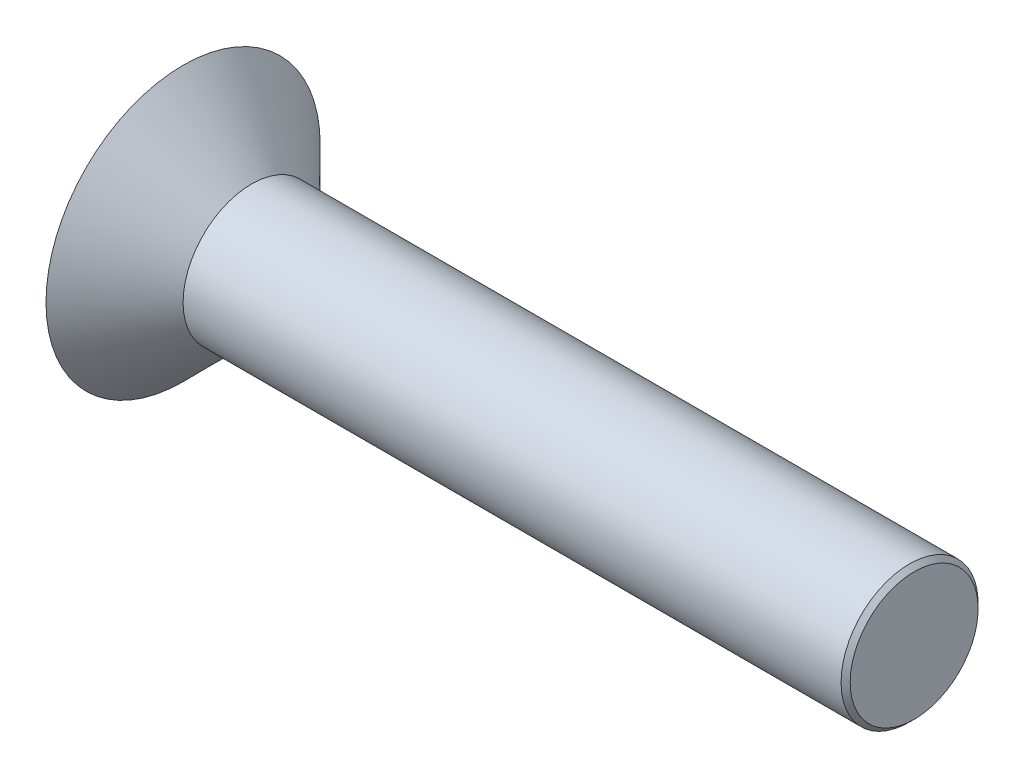
ISO-10303-21;
HEADER;
FILE_DESCRIPTION(('STEP AP214'),'2;1');
FILE_NAME('part.step','',(''),(''),'','','');
FILE_SCHEMA(('AUTOMOTIVE_DESIGN { 1 0 10303 214 1 1 1 1 }'));
ENDSEC;
DATA;
#1=APPLICATION_CONTEXT('core data for automotive mechanical design processes');
#2=APPLICATION_PROTOCOL_DEFINITION('international standard','automotive_design',2000,#1);
#3=PRODUCT_CONTEXT('',#1,'mechanical');
#4=PRODUCT('Part','Part','',(#3));
#5=PRODUCT_RELATED_PRODUCT_CATEGORY('part','',(#4));
#6=PRODUCT_DEFINITION_FORMATION('','',#4);
#7=PRODUCT_DEFINITION_CONTEXT('part definition',#1,'design');
#8=PRODUCT_DEFINITION('design','',#6,#7);
#9=PRODUCT_DEFINITION_SHAPE('','',#8);
#10=(LENGTH_UNIT() NAMED_UNIT(*) SI_UNIT(.MILLI.,.METRE.));
#11=(NAMED_UNIT(*) PLANE_ANGLE_UNIT() SI_UNIT($,.RADIAN.));
#12=(NAMED_UNIT(*) SI_UNIT($,.STERADIAN.) SOLID_ANGLE_UNIT());
#13=UNCERTAINTY_MEASURE_WITH_UNIT(LENGTH_MEASURE(1.E-05),#10,'distance_accuracy_value','');
#14=(GEOMETRIC_REPRESENTATION_CONTEXT(3) GLOBAL_UNCERTAINTY_ASSIGNED_CONTEXT((#13)) GLOBAL_UNIT_ASSIGNED_CONTEXT((#10,
#11,#12)) REPRESENTATION_CONTEXT('',''));
#15=CARTESIAN_POINT('',(0.,0.,0.));
#16=DIRECTION('',(0.,0.,1.));
#17=DIRECTION('',(1.,0.,0.));
#18=AXIS2_PLACEMENT_3D('',#15,#16,#17);
#19=CARTESIAN_POINT('',(0.,0.,0.));
#20=DIRECTION('',(1.,0.,0.));
#21=DIRECTION('',(0.,0.,-1.));
#22=AXIS2_PLACEMENT_3D('',#19,#20,#21);
#23=PLANE('',#22);
#24=DIRECTION('',(0.,0.866025403784439,-0.5));
#25=VECTOR('',#24,1.);
#26=CARTESIAN_POINT('',(0.,0.,1.44337567297406));
#27=LINE('',#26,#25);
#28=CARTESIAN_POINT('',(0.,0.,1.44337567297407));
#29=VERTEX_POINT('',#28);
#30=CARTESIAN_POINT('',(0.,1.25,0.721687836487031));
#31=VERTEX_POINT('',#30);
#32=EDGE_CURVE('E128',#29,#31,#27,.T.);
#33=ORIENTED_EDGE('',*,*,#32,.F.);
#34=DIRECTION('',(0.,0.866025403784438,0.5));
#35=VECTOR('',#34,1.);
#36=CARTESIAN_POINT('',(0.,-1.25,0.721687836487032));
#37=LINE('',#36,#35);
#38=CARTESIAN_POINT('',(0.,-1.25,0.721687836487032));
#39=VERTEX_POINT('',#38);
#40=EDGE_CURVE('E54',#39,#29,#37,.T.);
#41=ORIENTED_EDGE('',*,*,#40,.F.);
#42=DIRECTION('',(0.,0.,1.));
#43=VECTOR('',#42,1.);
#44=CARTESIAN_POINT('',(0.,-1.25,-0.721687836487033));
#45=LINE('',#44,#43);
#46=CARTESIAN_POINT('',(0.,-1.25,-0.721687836487033));
#47=VERTEX_POINT('',#46);
#48=EDGE_CURVE('E137',#47,#39,#45,.T.);
#49=ORIENTED_EDGE('',*,*,#48,.F.);
#50=DIRECTION('',(0.,-0.866025403784438,0.5));
#51=VECTOR('',#50,1.);
#52=CARTESIAN_POINT('',(0.,0.,-1.44337567297407));
#53=LINE('',#52,#51);
#54=CARTESIAN_POINT('',(0.,0.,-1.44337567297407));
#55=VERTEX_POINT('',#54);
#56=EDGE_CURVE('E135',#55,#47,#53,.T.);
#57=ORIENTED_EDGE('',*,*,#56,.F.);
#58=DIRECTION('',(0.,-0.866025403784439,-0.5));
#59=VECTOR('',#58,1.);
#60=CARTESIAN_POINT('',(0.,1.25,-0.721687836487033));
#61=LINE('',#60,#59);
#62=CARTESIAN_POINT('',(0.,1.25,-0.721687836487033));
#63=VERTEX_POINT('',#62);
#64=EDGE_CURVE('E102',#63,#55,#61,.T.);
#65=ORIENTED_EDGE('',*,*,#64,.F.);
#66=DIRECTION('',(0.,0.,-1.));
#67=VECTOR('',#66,1.);
#68=CARTESIAN_POINT('',(0.,1.25,0.721687836487031));
#69=LINE('',#68,#67);
#70=EDGE_CURVE('E131',#31,#63,#69,.T.);
#71=ORIENTED_EDGE('',*,*,#70,.F.);
#72=EDGE_LOOP('',(#33,#41,#49,#57,#65,#71));
#73=FACE_BOUND('',#72,.T.);
#74=CARTESIAN_POINT('',(0.,0.,0.));
#75=DIRECTION('',(-1.,0.,0.));
#76=DIRECTION('',(0.,0.,1.));
#77=AXIS2_PLACEMENT_3D('',#74,#75,#76);
#78=CIRCLE('',#77,3.);
#79=CARTESIAN_POINT('',(0.,0.,3.));
#80=VERTEX_POINT('',#79);
#81=EDGE_CURVE('E149',#80,#80,#78,.T.);
#82=ORIENTED_EDGE('',*,*,#81,.T.);
#83=EDGE_LOOP('',(#82));
#84=FACE_BOUND('',#83,.T.);
#85=ADVANCED_FACE('F39',(#73,#84),#23,.F.);
#86=CARTESIAN_POINT('',(1.49999999999999,0.,0.));
#87=DIRECTION('',(-1.,0.,0.));
#88=DIRECTION('',(0.,0.,1.));
#89=AXIS2_PLACEMENT_3D('',#86,#87,#88);
#90=CONICAL_SURFACE('',#89,1.5,0.78539816339745);
#91=ORIENTED_EDGE('',*,*,#81,.F.);
#92=EDGE_LOOP('',(#91));
#93=FACE_BOUND('',#92,.T.);
#94=CARTESIAN_POINT('',(1.49999999999999,0.,0.));
#95=DIRECTION('',(-1.,0.,0.));
#96=DIRECTION('',(0.,0.,1.));
#97=AXIS2_PLACEMENT_3D('',#94,#95,#96);
#98=CIRCLE('',#97,1.5);
#99=CARTESIAN_POINT('',(1.49999999999999,0.,1.5));
#100=VERTEX_POINT('',#99);
#101=EDGE_CURVE('E141',#100,#100,#98,.T.);
#102=ORIENTED_EDGE('',*,*,#101,.T.);
#103=EDGE_LOOP('',(#102));
#104=FACE_BOUND('',#103,.T.);
#105=ADVANCED_FACE('F166',(#93,#104),#90,.T.);
#106=CARTESIAN_POINT('',(0.,0.,0.));
#107=DIRECTION('',(-1.,0.,0.));
#108=DIRECTION('',(0.,0.,1.));
#109=AXIS2_PLACEMENT_3D('',#106,#107,#108);
#110=CYLINDRICAL_SURFACE('',#109,1.5);
#111=CARTESIAN_POINT('',(15.9,0.,0.));
#112=DIRECTION('',(-1.,0.,0.));
#113=DIRECTION('',(0.,0.,1.));
#114=AXIS2_PLACEMENT_3D('',#111,#112,#113);
#115=CIRCLE('',#114,1.5);
#116=CARTESIAN_POINT('',(15.9,0.,1.5));
#117=VERTEX_POINT('',#116);
#118=EDGE_CURVE('E47',#117,#117,#115,.T.);
#119=ORIENTED_EDGE('',*,*,#118,.T.);
#120=EDGE_LOOP('',(#119));
#121=FACE_BOUND('',#120,.T.);
#122=ORIENTED_EDGE('',*,*,#101,.F.);
#123=EDGE_LOOP('',(#122));
#124=FACE_BOUND('',#123,.T.);
#125=ADVANCED_FACE('F154',(#121,#124),#110,.T.);
#126=CARTESIAN_POINT('',(16.,0.,-1.5));
#127=DIRECTION('',(-1.,0.,0.));
#128=DIRECTION('',(0.,0.,1.));
#129=AXIS2_PLACEMENT_3D('',#126,#127,#128);
#130=PLANE('',#129);
#131=CARTESIAN_POINT('',(16.,0.,0.));
#132=DIRECTION('',(-1.,0.,0.));
#133=DIRECTION('',(0.,0.,1.));
#134=AXIS2_PLACEMENT_3D('',#131,#132,#133);
#135=CIRCLE('',#134,1.4);
#136=CARTESIAN_POINT('',(16.,0.,1.4));
#137=VERTEX_POINT('',#136);
#138=EDGE_CURVE('E11',#137,#137,#135,.F.);
#139=ORIENTED_EDGE('',*,*,#138,.T.);
#140=EDGE_LOOP('',(#139));
#141=FACE_BOUND('',#140,.T.);
#142=ADVANCED_FACE('F178',(#141),#130,.F.);
#143=CARTESIAN_POINT('',(1.2,-1.25,0.721687836487032));
#144=DIRECTION('',(0.,-0.5,0.866025403784439));
#145=DIRECTION('',(0.,-0.866025403784439,-0.5));
#146=AXIS2_PLACEMENT_3D('',#143,#144,#145);
#147=PLANE('',#146);
#148=ORIENTED_EDGE('',*,*,#40,.T.);
#149=DIRECTION('',(-1.,0.,0.));
#150=VECTOR('',#149,1.);
#151=CARTESIAN_POINT('',(1.2,0.,1.44337567297406));
#152=LINE('',#151,#150);
#153=CARTESIAN_POINT('',(1.2,0.,1.44337567297406));
#154=VERTEX_POINT('',#153);
#155=EDGE_CURVE('E84',#154,#29,#152,.T.);
#156=ORIENTED_EDGE('',*,*,#155,.F.);
#157=DIRECTION('',(0.,0.866025403784438,0.5));
#158=VECTOR('',#157,1.);
#159=CARTESIAN_POINT('',(1.2,-1.25,0.721687836487032));
#160=LINE('',#159,#158);
#161=CARTESIAN_POINT('',(1.2,-1.25,0.721687836487032));
#162=VERTEX_POINT('',#161);
#163=EDGE_CURVE('E139',#162,#154,#160,.T.);
#164=ORIENTED_EDGE('',*,*,#163,.F.);
#165=DIRECTION('',(-1.,0.,0.));
#166=VECTOR('',#165,1.);
#167=CARTESIAN_POINT('',(1.2,-1.25,0.721687836487032));
#168=LINE('',#167,#166);
#169=EDGE_CURVE('E62',#162,#39,#168,.T.);
#170=ORIENTED_EDGE('',*,*,#169,.T.);
#171=EDGE_LOOP('',(#148,#156,#164,#170));
#172=FACE_BOUND('',#171,.T.);
#173=ADVANCED_FACE('F181',(#172),#147,.F.);
#174=CARTESIAN_POINT('',(1.2,-1.25,-0.721687836487033));
#175=DIRECTION('',(0.,-1.,0.));
#176=DIRECTION('',(0.,0.,-1.));
#177=AXIS2_PLACEMENT_3D('',#174,#175,#176);
#178=PLANE('',#177);
#179=ORIENTED_EDGE('',*,*,#48,.T.);
#180=ORIENTED_EDGE('',*,*,#169,.F.);
#181=DIRECTION('',(0.,0.,1.));
#182=VECTOR('',#181,1.);
#183=CARTESIAN_POINT('',(1.2,-1.25,-0.721687836487033));
#184=LINE('',#183,#182);
#185=CARTESIAN_POINT('',(1.2,-1.25,-0.721687836487033));
#186=VERTEX_POINT('',#185);
#187=EDGE_CURVE('E114',#186,#162,#184,.T.);
#188=ORIENTED_EDGE('',*,*,#187,.F.);
#189=DIRECTION('',(-1.,0.,0.));
#190=VECTOR('',#189,1.);
#191=CARTESIAN_POINT('',(1.2,-1.25,-0.721687836487033));
#192=LINE('',#191,#190);
#193=EDGE_CURVE('E106',#186,#47,#192,.T.);
#194=ORIENTED_EDGE('',*,*,#193,.T.);
#195=EDGE_LOOP('',(#179,#180,#188,#194));
#196=FACE_BOUND('',#195,.T.);
#197=ADVANCED_FACE('F185',(#196),#178,.F.);
#198=CARTESIAN_POINT('',(1.2,0.,-1.44337567297407));
#199=DIRECTION('',(0.,-0.5,-0.866025403784439));
#200=DIRECTION('',(0.,0.866025403784439,-0.5));
#201=AXIS2_PLACEMENT_3D('',#198,#199,#200);
#202=PLANE('',#201);
#203=ORIENTED_EDGE('',*,*,#56,.T.);
#204=ORIENTED_EDGE('',*,*,#193,.F.);
#205=DIRECTION('',(0.,-0.866025403784438,0.5));
#206=VECTOR('',#205,1.);
#207=CARTESIAN_POINT('',(1.2,0.,-1.44337567297407));
#208=LINE('',#207,#206);
#209=CARTESIAN_POINT('',(1.2,0.,-1.44337567297407));
#210=VERTEX_POINT('',#209);
#211=EDGE_CURVE('E110',#210,#186,#208,.T.);
#212=ORIENTED_EDGE('',*,*,#211,.F.);
#213=DIRECTION('',(-1.,0.,0.));
#214=VECTOR('',#213,1.);
#215=CARTESIAN_POINT('',(1.2,0.,-1.44337567297407));
#216=LINE('',#215,#214);
#217=EDGE_CURVE('E95',#210,#55,#216,.T.);
#218=ORIENTED_EDGE('',*,*,#217,.T.);
#219=EDGE_LOOP('',(#203,#204,#212,#218));
#220=FACE_BOUND('',#219,.T.);
#221=ADVANCED_FACE('F111',(#220),#202,.F.);
#222=CARTESIAN_POINT('',(1.2,1.25,-0.721687836487033));
#223=DIRECTION('',(0.,0.5,-0.866025403784439));
#224=DIRECTION('',(0.,0.866025403784439,0.5));
#225=AXIS2_PLACEMENT_3D('',#222,#223,#224);
#226=PLANE('',#225);
#227=ORIENTED_EDGE('',*,*,#64,.T.);
#228=ORIENTED_EDGE('',*,*,#217,.F.);
#229=DIRECTION('',(0.,-0.866025403784439,-0.5));
#230=VECTOR('',#229,1.);
#231=CARTESIAN_POINT('',(1.2,1.25,-0.721687836487033));
#232=LINE('',#231,#230);
#233=CARTESIAN_POINT('',(1.2,1.25,-0.721687836487033));
#234=VERTEX_POINT('',#233);
#235=EDGE_CURVE('E99',#234,#210,#232,.T.);
#236=ORIENTED_EDGE('',*,*,#235,.F.);
#237=DIRECTION('',(-1.,0.,0.));
#238=VECTOR('',#237,1.);
#239=CARTESIAN_POINT('',(1.2,1.25,-0.721687836487033));
#240=LINE('',#239,#238);
#241=EDGE_CURVE('E107',#234,#63,#240,.T.);
#242=ORIENTED_EDGE('',*,*,#241,.T.);
#243=EDGE_LOOP('',(#227,#228,#236,#242));
#244=FACE_BOUND('',#243,.T.);
#245=ADVANCED_FACE('F97',(#244),#226,.F.);
#246=CARTESIAN_POINT('',(1.2,1.25,0.721687836487031));
#247=DIRECTION('',(0.,1.,0.));
#248=DIRECTION('',(0.,0.,1.));
#249=AXIS2_PLACEMENT_3D('',#246,#247,#248);
#250=PLANE('',#249);
#251=ORIENTED_EDGE('',*,*,#70,.T.);
#252=ORIENTED_EDGE('',*,*,#241,.F.);
#253=DIRECTION('',(0.,0.,-1.));
#254=VECTOR('',#253,1.);
#255=CARTESIAN_POINT('',(1.2,1.25,0.721687836487031));
#256=LINE('',#255,#254);
#257=CARTESIAN_POINT('',(1.2,1.25,0.721687836487031));
#258=VERTEX_POINT('',#257);
#259=EDGE_CURVE('E120',#258,#234,#256,.T.);
#260=ORIENTED_EDGE('',*,*,#259,.F.);
#261=DIRECTION('',(-1.,0.,0.));
#262=VECTOR('',#261,1.);
#263=CARTESIAN_POINT('',(1.2,1.25,0.721687836487031));
#264=LINE('',#263,#262);
#265=EDGE_CURVE('E144',#258,#31,#264,.T.);
#266=ORIENTED_EDGE('',*,*,#265,.T.);
#267=EDGE_LOOP('',(#251,#252,#260,#266));
#268=FACE_BOUND('',#267,.T.);
#269=ADVANCED_FACE('F188',(#268),#250,.F.);
#270=CARTESIAN_POINT('',(1.2,0.,1.44337567297406));
#271=DIRECTION('',(0.,0.5,0.866025403784438));
#272=DIRECTION('',(0.,-0.866025403784439,0.5));
#273=AXIS2_PLACEMENT_3D('',#270,#271,#272);
#274=PLANE('',#273);
#275=ORIENTED_EDGE('',*,*,#32,.T.);
#276=ORIENTED_EDGE('',*,*,#265,.F.);
#277=DIRECTION('',(0.,0.866025403784439,-0.5));
#278=VECTOR('',#277,1.);
#279=CARTESIAN_POINT('',(1.2,0.,1.44337567297406));
#280=LINE('',#279,#278);
#281=EDGE_CURVE('E122',#154,#258,#280,.T.);
#282=ORIENTED_EDGE('',*,*,#281,.F.);
#283=ORIENTED_EDGE('',*,*,#155,.T.);
#284=EDGE_LOOP('',(#275,#276,#282,#283));
#285=FACE_BOUND('',#284,.T.);
#286=ADVANCED_FACE('F162',(#285),#274,.F.);
#287=CARTESIAN_POINT('',(1.2,0.,0.));
#288=DIRECTION('',(-1.,0.,0.));
#289=DIRECTION('',(0.,0.,1.));
#290=AXIS2_PLACEMENT_3D('',#287,#288,#289);
#291=PLANE('',#290);
#292=ORIENTED_EDGE('',*,*,#163,.T.);
#293=ORIENTED_EDGE('',*,*,#281,.T.);
#294=ORIENTED_EDGE('',*,*,#259,.T.);
#295=ORIENTED_EDGE('',*,*,#235,.T.);
#296=ORIENTED_EDGE('',*,*,#211,.T.);
#297=ORIENTED_EDGE('',*,*,#187,.T.);
#298=EDGE_LOOP('',(#292,#293,#294,#295,#296,#297));
#299=FACE_BOUND('',#298,.T.);
#300=ADVANCED_FACE('F117',(#299),#291,.T.);
#301=CARTESIAN_POINT('',(15.9,0.,0.));
#302=DIRECTION('',(-1.,0.,0.));
#303=DIRECTION('',(0.,0.,1.));
#304=AXIS2_PLACEMENT_3D('',#301,#302,#303);
#305=CONICAL_SURFACE('',#304,1.5,0.785398163397443);
#306=ORIENTED_EDGE('',*,*,#138,.F.);
#307=EDGE_LOOP('',(#306));
#308=FACE_BOUND('',#307,.T.);
#309=ORIENTED_EDGE('',*,*,#118,.F.);
#310=EDGE_LOOP('',(#309));
#311=FACE_BOUND('',#310,.T.);
#312=ADVANCED_FACE('F41',(#308,#311),#305,.T.);
#313=CLOSED_SHELL('',(#85,#105,#125,#142,#173,#197,#221,#245,#269,#286,#300,#312));
#314=MANIFOLD_SOLID_BREP('B2',#313);
#315=ADVANCED_BREP_SHAPE_REPRESENTATION('',(#18,#314),#14);
#316=SHAPE_DEFINITION_REPRESENTATION(#9,#315);
ENDSEC;
END-ISO-10303-21;
